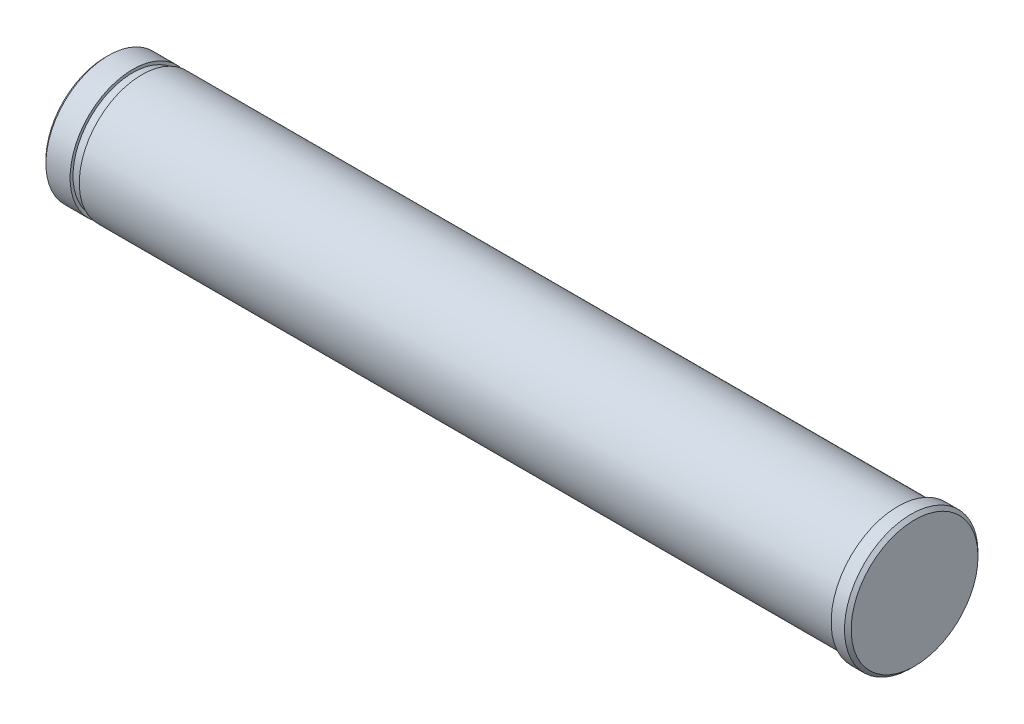
ISO-10303-21;
HEADER;
FILE_DESCRIPTION(('STEP AP214'),'2;1');
FILE_NAME('part.step','',(''),(''),'','','');
FILE_SCHEMA(('AUTOMOTIVE_DESIGN { 1 0 10303 214 1 1 1 1 }'));
ENDSEC;
DATA;
#1=APPLICATION_CONTEXT('core data for automotive mechanical design processes');
#2=APPLICATION_PROTOCOL_DEFINITION('international standard','automotive_design',2000,#1);
#3=PRODUCT_CONTEXT('',#1,'mechanical');
#4=PRODUCT('Part','Part','',(#3));
#5=PRODUCT_RELATED_PRODUCT_CATEGORY('part','',(#4));
#6=PRODUCT_DEFINITION_FORMATION('','',#4);
#7=PRODUCT_DEFINITION_CONTEXT('part definition',#1,'design');
#8=PRODUCT_DEFINITION('design','',#6,#7);
#9=PRODUCT_DEFINITION_SHAPE('','',#8);
#10=(LENGTH_UNIT() NAMED_UNIT(*) SI_UNIT(.MILLI.,.METRE.));
#11=(NAMED_UNIT(*) PLANE_ANGLE_UNIT() SI_UNIT($,.RADIAN.));
#12=(NAMED_UNIT(*) SI_UNIT($,.STERADIAN.) SOLID_ANGLE_UNIT());
#13=UNCERTAINTY_MEASURE_WITH_UNIT(LENGTH_MEASURE(1.E-05),#10,'distance_accuracy_value','');
#14=(GEOMETRIC_REPRESENTATION_CONTEXT(3) GLOBAL_UNCERTAINTY_ASSIGNED_CONTEXT((#13)) GLOBAL_UNIT_ASSIGNED_CONTEXT((#10,
#11,#12)) REPRESENTATION_CONTEXT('',''));
#15=CARTESIAN_POINT('',(0.,0.,0.));
#16=DIRECTION('',(0.,0.,1.));
#17=DIRECTION('',(1.,0.,0.));
#18=AXIS2_PLACEMENT_3D('',#15,#16,#17);
#19=CARTESIAN_POINT('',(47.5,0.,0.));
#20=DIRECTION('',(-1.,0.,0.));
#21=DIRECTION('',(0.,0.,1.));
#22=AXIS2_PLACEMENT_3D('',#19,#20,#21);
#23=CYLINDRICAL_SURFACE('',#22,7.5);
#24=CARTESIAN_POINT('',(-43.1,0.,0.));
#25=DIRECTION('',(1.,0.,0.));
#26=DIRECTION('',(0.,0.,-1.));
#27=AXIS2_PLACEMENT_3D('',#24,#25,#26);
#28=CIRCLE('',#27,7.5);
#29=CARTESIAN_POINT('',(-43.1,0.,-7.5));
#30=VERTEX_POINT('',#29);
#31=EDGE_CURVE('E65',#30,#30,#28,.T.);
#32=ORIENTED_EDGE('',*,*,#31,.T.);
#33=EDGE_LOOP('',(#32));
#34=FACE_BOUND('',#33,.T.);
#35=CARTESIAN_POINT('',(47.5,0.,0.));
#36=DIRECTION('',(1.,0.,0.));
#37=DIRECTION('',(0.,0.,-1.));
#38=AXIS2_PLACEMENT_3D('',#35,#36,#37);
#39=CIRCLE('',#38,7.5);
#40=CARTESIAN_POINT('',(47.5,0.,-7.5));
#41=VERTEX_POINT('',#40);
#42=EDGE_CURVE('E53',#41,#41,#39,.T.);
#43=ORIENTED_EDGE('',*,*,#42,.F.);
#44=EDGE_LOOP('',(#43));
#45=FACE_BOUND('',#44,.T.);
#46=ADVANCED_FACE('F33',(#34,#45),#23,.T.);
#47=CARTESIAN_POINT('',(49.5,0.,0.));
#48=DIRECTION('',(-1.,0.,0.));
#49=DIRECTION('',(0.,0.,1.));
#50=AXIS2_PLACEMENT_3D('',#47,#48,#49);
#51=CYLINDRICAL_SURFACE('',#50,8.);
#52=CARTESIAN_POINT('',(49.1,0.,0.));
#53=DIRECTION('',(1.,0.,0.));
#54=DIRECTION('',(0.,0.,-1.));
#55=AXIS2_PLACEMENT_3D('',#52,#53,#54);
#56=CIRCLE('',#55,8.);
#57=CARTESIAN_POINT('',(49.1,0.,-8.));
#58=VERTEX_POINT('',#57);
#59=EDGE_CURVE('E44',#58,#58,#56,.F.);
#60=ORIENTED_EDGE('',*,*,#59,.T.);
#61=EDGE_LOOP('',(#60));
#62=FACE_BOUND('',#61,.T.);
#63=CARTESIAN_POINT('',(47.5,0.,0.));
#64=DIRECTION('',(1.,0.,0.));
#65=DIRECTION('',(0.,0.,-1.));
#66=AXIS2_PLACEMENT_3D('',#63,#64,#65);
#67=CIRCLE('',#66,8.);
#68=CARTESIAN_POINT('',(47.5,0.,-8.));
#69=VERTEX_POINT('',#68);
#70=EDGE_CURVE('E56',#69,#69,#67,.T.);
#71=ORIENTED_EDGE('',*,*,#70,.T.);
#72=EDGE_LOOP('',(#71));
#73=FACE_BOUND('',#72,.T.);
#74=ADVANCED_FACE('F88',(#62,#73),#51,.T.);
#75=CARTESIAN_POINT('',(49.5,0.,0.));
#76=DIRECTION('',(1.,0.,0.));
#77=DIRECTION('',(0.,0.,-1.));
#78=AXIS2_PLACEMENT_3D('',#75,#76,#77);
#79=PLANE('',#78);
#80=CARTESIAN_POINT('',(49.5,0.,0.));
#81=DIRECTION('',(1.,0.,0.));
#82=DIRECTION('',(0.,0.,-1.));
#83=AXIS2_PLACEMENT_3D('',#80,#81,#82);
#84=CIRCLE('',#83,7.60000000000001);
#85=CARTESIAN_POINT('',(49.5,0.,-7.60000000000001));
#86=VERTEX_POINT('',#85);
#87=EDGE_CURVE('E48',#86,#86,#84,.T.);
#88=ORIENTED_EDGE('',*,*,#87,.T.);
#89=EDGE_LOOP('',(#88));
#90=FACE_BOUND('',#89,.T.);
#91=ADVANCED_FACE('F95',(#90),#79,.T.);
#92=CARTESIAN_POINT('',(47.5,0.,0.));
#93=DIRECTION('',(1.,0.,0.));
#94=DIRECTION('',(0.,0.,-1.));
#95=AXIS2_PLACEMENT_3D('',#92,#93,#94);
#96=PLANE('',#95);
#97=ORIENTED_EDGE('',*,*,#42,.T.);
#98=EDGE_LOOP('',(#97));
#99=FACE_BOUND('',#98,.T.);
#100=ORIENTED_EDGE('',*,*,#70,.F.);
#101=EDGE_LOOP('',(#100));
#102=FACE_BOUND('',#101,.T.);
#103=ADVANCED_FACE('F102',(#99,#102),#96,.F.);
#104=CARTESIAN_POINT('',(-44.2,0.,-7.5));
#105=DIRECTION('',(-1.,0.,0.));
#106=DIRECTION('',(0.,0.,1.));
#107=AXIS2_PLACEMENT_3D('',#104,#105,#106);
#108=PLANE('',#107);
#109=CARTESIAN_POINT('',(-44.2,0.,0.));
#110=DIRECTION('',(1.,0.,0.));
#111=DIRECTION('',(0.,0.,-1.));
#112=AXIS2_PLACEMENT_3D('',#109,#110,#111);
#113=CIRCLE('',#112,7.15);
#114=CARTESIAN_POINT('',(-44.2,0.,-7.15));
#115=VERTEX_POINT('',#114);
#116=EDGE_CURVE('E59',#115,#115,#113,.T.);
#117=ORIENTED_EDGE('',*,*,#116,.F.);
#118=EDGE_LOOP('',(#117));
#119=FACE_BOUND('',#118,.T.);
#120=CARTESIAN_POINT('',(-44.2,0.,0.));
#121=DIRECTION('',(1.,0.,0.));
#122=DIRECTION('',(0.,0.,-1.));
#123=AXIS2_PLACEMENT_3D('',#120,#121,#122);
#124=CIRCLE('',#123,7.5);
#125=CARTESIAN_POINT('',(-44.2,0.,-7.5));
#126=VERTEX_POINT('',#125);
#127=EDGE_CURVE('E68',#126,#126,#124,.T.);
#128=ORIENTED_EDGE('',*,*,#127,.T.);
#129=EDGE_LOOP('',(#128));
#130=FACE_BOUND('',#129,.T.);
#131=ADVANCED_FACE('F72',(#119,#130),#108,.F.);
#132=CARTESIAN_POINT('',(0.,0.,0.));
#133=DIRECTION('',(1.,0.,0.));
#134=DIRECTION('',(0.,0.,-1.));
#135=AXIS2_PLACEMENT_3D('',#132,#133,#134);
#136=CYLINDRICAL_SURFACE('',#135,7.15);
#137=CARTESIAN_POINT('',(-43.1,0.,0.));
#138=DIRECTION('',(1.,0.,0.));
#139=DIRECTION('',(0.,0.,-1.));
#140=AXIS2_PLACEMENT_3D('',#137,#138,#139);
#141=CIRCLE('',#140,7.15);
#142=CARTESIAN_POINT('',(-43.1,0.,-7.15));
#143=VERTEX_POINT('',#142);
#144=EDGE_CURVE('E62',#143,#143,#141,.T.);
#145=ORIENTED_EDGE('',*,*,#144,.F.);
#146=EDGE_LOOP('',(#145));
#147=FACE_BOUND('',#146,.T.);
#148=ORIENTED_EDGE('',*,*,#116,.T.);
#149=EDGE_LOOP('',(#148));
#150=FACE_BOUND('',#149,.T.);
#151=ADVANCED_FACE('F112',(#147,#150),#136,.T.);
#152=CARTESIAN_POINT('',(-43.1,0.,-7.5));
#153=DIRECTION('',(1.,0.,0.));
#154=DIRECTION('',(0.,0.,-1.));
#155=AXIS2_PLACEMENT_3D('',#152,#153,#154);
#156=PLANE('',#155);
#157=ORIENTED_EDGE('',*,*,#31,.F.);
#158=EDGE_LOOP('',(#157));
#159=FACE_BOUND('',#158,.T.);
#160=ORIENTED_EDGE('',*,*,#144,.T.);
#161=EDGE_LOOP('',(#160));
#162=FACE_BOUND('',#161,.T.);
#163=ADVANCED_FACE('F85',(#159,#162),#156,.F.);
#164=CARTESIAN_POINT('',(-47.5,0.,0.));
#165=DIRECTION('',(1.,0.,0.));
#166=DIRECTION('',(0.,0.,-1.));
#167=AXIS2_PLACEMENT_3D('',#164,#165,#166);
#168=PLANE('',#167);
#169=CARTESIAN_POINT('',(-47.5,0.,0.));
#170=DIRECTION('',(1.,0.,0.));
#171=DIRECTION('',(0.,0.,-1.));
#172=AXIS2_PLACEMENT_3D('',#169,#170,#171);
#173=CIRCLE('',#172,7.10000000000001);
#174=CARTESIAN_POINT('',(-47.5,0.,-7.10000000000001));
#175=VERTEX_POINT('',#174);
#176=EDGE_CURVE('E10',#175,#175,#173,.F.);
#177=ORIENTED_EDGE('',*,*,#176,.T.);
#178=EDGE_LOOP('',(#177));
#179=FACE_BOUND('',#178,.T.);
#180=ADVANCED_FACE('F77',(#179),#168,.F.);
#181=CARTESIAN_POINT('',(-47.1,0.,0.));
#182=DIRECTION('',(1.,0.,0.));
#183=DIRECTION('',(0.,0.,-1.));
#184=AXIS2_PLACEMENT_3D('',#181,#182,#183);
#185=CIRCLE('',#184,7.5);
#186=CARTESIAN_POINT('',(-47.1,0.,-7.5));
#187=VERTEX_POINT('',#186);
#188=EDGE_CURVE('E40',#187,#187,#185,.T.);
#189=ORIENTED_EDGE('',*,*,#188,.T.);
#190=EDGE_LOOP('',(#189));
#191=FACE_BOUND('',#190,.T.);
#192=ORIENTED_EDGE('',*,*,#127,.F.);
#193=EDGE_LOOP('',(#192));
#194=FACE_BOUND('',#193,.T.);
#195=ADVANCED_FACE('F74',(#191,#194),#23,.T.);
#196=CARTESIAN_POINT('',(49.5,0.,0.));
#197=DIRECTION('',(-1.,0.,0.));
#198=DIRECTION('',(0.,0.,1.));
#199=AXIS2_PLACEMENT_3D('',#196,#197,#198);
#200=CONICAL_SURFACE('',#199,7.60000000000001,0.785398163397448);
#201=ORIENTED_EDGE('',*,*,#59,.F.);
#202=EDGE_LOOP('',(#201));
#203=FACE_BOUND('',#202,.T.);
#204=ORIENTED_EDGE('',*,*,#87,.F.);
#205=EDGE_LOOP('',(#204));
#206=FACE_BOUND('',#205,.T.);
#207=ADVANCED_FACE('F76',(#203,#206),#200,.T.);
#208=CARTESIAN_POINT('',(-47.1,0.,0.));
#209=DIRECTION('',(1.,0.,0.));
#210=DIRECTION('',(0.,0.,-1.));
#211=AXIS2_PLACEMENT_3D('',#208,#209,#210);
#212=CONICAL_SURFACE('',#211,7.5,0.785398163397458);
#213=ORIENTED_EDGE('',*,*,#176,.F.);
#214=EDGE_LOOP('',(#213));
#215=FACE_BOUND('',#214,.T.);
#216=ORIENTED_EDGE('',*,*,#188,.F.);
#217=EDGE_LOOP('',(#216));
#218=FACE_BOUND('',#217,.T.);
#219=ADVANCED_FACE('F35',(#215,#218),#212,.T.);
#220=CLOSED_SHELL('',(#46,#74,#91,#103,#131,#151,#163,#180,#195,#207,#219));
#221=MANIFOLD_SOLID_BREP('B2',#220);
#222=ADVANCED_BREP_SHAPE_REPRESENTATION('',(#18,#221),#14);
#223=SHAPE_DEFINITION_REPRESENTATION(#9,#222);
ENDSEC;
END-ISO-10303-21;
